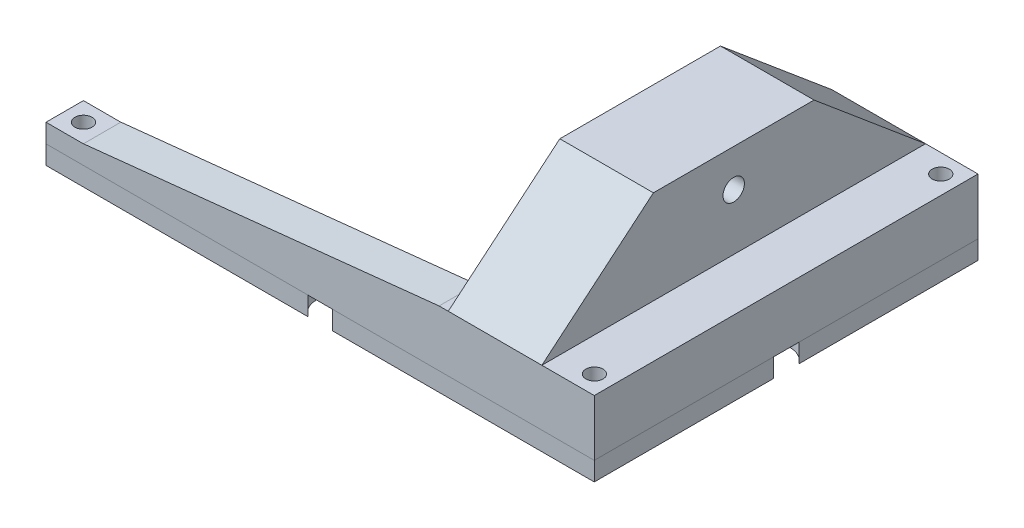
ISO-10303-21;
HEADER;
FILE_DESCRIPTION(('STEP AP214'),'2;1');
FILE_NAME('part.step','',(''),(''),'','','');
FILE_SCHEMA(('AUTOMOTIVE_DESIGN { 1 0 10303 214 1 1 1 1 }'));
ENDSEC;
DATA;
#1=APPLICATION_CONTEXT('core data for automotive mechanical design processes');
#2=APPLICATION_PROTOCOL_DEFINITION('international standard','automotive_design',2000,#1);
#3=PRODUCT_CONTEXT('',#1,'mechanical');
#4=PRODUCT('Part','Part','',(#3));
#5=PRODUCT_RELATED_PRODUCT_CATEGORY('part','',(#4));
#6=PRODUCT_DEFINITION_FORMATION('','',#4);
#7=PRODUCT_DEFINITION_CONTEXT('part definition',#1,'design');
#8=PRODUCT_DEFINITION('design','',#6,#7);
#9=PRODUCT_DEFINITION_SHAPE('','',#8);
#10=(LENGTH_UNIT() NAMED_UNIT(*) SI_UNIT(.MILLI.,.METRE.));
#11=(NAMED_UNIT(*) PLANE_ANGLE_UNIT() SI_UNIT($,.RADIAN.));
#12=(NAMED_UNIT(*) SI_UNIT($,.STERADIAN.) SOLID_ANGLE_UNIT());
#13=UNCERTAINTY_MEASURE_WITH_UNIT(LENGTH_MEASURE(1.E-05),#10,'distance_accuracy_value','');
#14=(GEOMETRIC_REPRESENTATION_CONTEXT(3) GLOBAL_UNCERTAINTY_ASSIGNED_CONTEXT((#13)) GLOBAL_UNIT_ASSIGNED_CONTEXT((#10,
#11,#12)) REPRESENTATION_CONTEXT('',''));
#15=CARTESIAN_POINT('',(0.,0.,0.));
#16=DIRECTION('',(0.,0.,1.));
#17=DIRECTION('',(1.,0.,0.));
#18=AXIS2_PLACEMENT_3D('',#15,#16,#17);
#19=CARTESIAN_POINT('',(-8.44101930610675,266.195974268059,0.));
#20=DIRECTION('',(-1.,0.,0.));
#21=DIRECTION('',(0.,-1.,0.));
#22=AXIS2_PLACEMENT_3D('',#19,#20,#21);
#23=PLANE('',#22);
#24=DIRECTION('',(0.,-1.,0.));
#25=VECTOR('',#24,1.);
#26=CARTESIAN_POINT('',(-8.44101930610706,266.195974268059,140.773129836377));
#27=LINE('',#26,#25);
#28=CARTESIAN_POINT('',(-8.44101930610693,256.195974268059,140.773129836377));
#29=VERTEX_POINT('',#28);
#30=CARTESIAN_POINT('',(-8.44101930610696,251.195974268059,140.773129836377));
#31=VERTEX_POINT('',#30);
#32=EDGE_CURVE('E151',#29,#31,#27,.T.);
#33=ORIENTED_EDGE('',*,*,#32,.F.);
#34=DIRECTION('',(0.,0.,1.));
#35=VECTOR('',#34,1.);
#36=CARTESIAN_POINT('',(-8.44101930610691,256.195974268059,130.773129836377));
#37=LINE('',#36,#35);
#38=CARTESIAN_POINT('',(-8.44101930610691,256.195974268059,130.773129836377));
#39=VERTEX_POINT('',#38);
#40=EDGE_CURVE('E140',#39,#29,#37,.T.);
#41=ORIENTED_EDGE('',*,*,#40,.F.);
#42=DIRECTION('',(0.,-1.,0.));
#43=VECTOR('',#42,1.);
#44=CARTESIAN_POINT('',(-8.44101930610704,266.195974268059,130.773129836377));
#45=LINE('',#44,#43);
#46=CARTESIAN_POINT('',(-8.44101930610693,251.195974268059,130.773129836377));
#47=VERTEX_POINT('',#46);
#48=EDGE_CURVE('E149',#39,#47,#45,.T.);
#49=ORIENTED_EDGE('',*,*,#48,.T.);
#50=DIRECTION('',(0.,0.,-1.));
#51=VECTOR('',#50,1.);
#52=CARTESIAN_POINT('',(-8.44101930610664,251.195974268059,0.));
#53=LINE('',#52,#51);
#54=EDGE_CURVE('E258',#31,#47,#53,.T.);
#55=ORIENTED_EDGE('',*,*,#54,.F.);
#56=EDGE_LOOP('',(#33,#41,#49,#55));
#57=FACE_BOUND('',#56,.T.);
#58=ADVANCED_FACE('F46',(#57),#23,.T.);
#59=CARTESIAN_POINT('',(-3.44101930610689,266.195974268059,135.773129836377));
#60=DIRECTION('',(0.,-1.,0.));
#61=DIRECTION('',(1.,0.,0.));
#62=AXIS2_PLACEMENT_3D('',#59,#60,#61);
#63=CYLINDRICAL_SURFACE('',#62,2.3);
#64=CARTESIAN_POINT('',(-3.44101930610678,251.195974268059,135.773129836377));
#65=DIRECTION('',(0.,1.,0.));
#66=DIRECTION('',(-1.,0.,0.));
#67=AXIS2_PLACEMENT_3D('',#64,#65,#66);
#68=CIRCLE('',#67,2.3);
#69=CARTESIAN_POINT('',(-5.74101930610678,251.195974268059,135.773129836377));
#70=VERTEX_POINT('',#69);
#71=EDGE_CURVE('E248',#70,#70,#68,.T.);
#72=ORIENTED_EDGE('',*,*,#71,.F.);
#73=EDGE_LOOP('',(#72));
#74=FACE_BOUND('',#73,.T.);
#75=CARTESIAN_POINT('',(-3.44101930610682,256.195974268059,135.773129836377));
#76=DIRECTION('',(0.,1.,0.));
#77=DIRECTION('',(-1.,0.,0.));
#78=AXIS2_PLACEMENT_3D('',#75,#76,#77);
#79=CIRCLE('',#78,2.3);
#80=CARTESIAN_POINT('',(-5.74101930610682,256.195974268059,135.773129836377));
#81=VERTEX_POINT('',#80);
#82=EDGE_CURVE('E172',#81,#81,#79,.T.);
#83=ORIENTED_EDGE('',*,*,#82,.T.);
#84=EDGE_LOOP('',(#83));
#85=FACE_BOUND('',#84,.T.);
#86=ADVANCED_FACE('F312',(#74,#85),#63,.F.);
#87=CARTESIAN_POINT('',(-1.86544632828996E-12,266.195974268059,0.));
#88=DIRECTION('',(0.,1.,0.));
#89=DIRECTION('',(-1.,0.,0.));
#90=AXIS2_PLACEMENT_3D('',#87,#88,#89);
#91=PLANE('',#90);
#92=DIRECTION('',(0.,0.,-1.));
#93=VECTOR('',#92,1.);
#94=CARTESIAN_POINT('',(124.010541363209,266.19597426806,140.773129836377));
#95=LINE('',#94,#93);
#96=CARTESIAN_POINT('',(124.010541363209,266.19597426806,140.773129836377));
#97=VERTEX_POINT('',#96);
#98=CARTESIAN_POINT('',(124.010541363209,266.19597426806,38.2731298363773));
#99=VERTEX_POINT('',#98);
#100=EDGE_CURVE('E212',#97,#99,#95,.T.);
#101=ORIENTED_EDGE('',*,*,#100,.F.);
#102=DIRECTION('',(-1.,0.,0.));
#103=VECTOR('',#102,1.);
#104=CARTESIAN_POINT('',(-1.86544632828996E-12,266.195974268059,140.773129836377));
#105=LINE('',#104,#103);
#106=CARTESIAN_POINT('',(138.010541363209,266.19597426806,140.773129836377));
#107=VERTEX_POINT('',#106);
#108=EDGE_CURVE('E236',#107,#97,#105,.T.);
#109=ORIENTED_EDGE('',*,*,#108,.F.);
#110=DIRECTION('',(0.,0.,1.));
#111=VECTOR('',#110,1.);
#112=CARTESIAN_POINT('',(138.010541363209,266.19597426806,0.));
#113=LINE('',#112,#111);
#114=CARTESIAN_POINT('',(138.010541363209,266.19597426806,38.2731298363773));
#115=VERTEX_POINT('',#114);
#116=EDGE_CURVE('E239',#115,#107,#113,.T.);
#117=ORIENTED_EDGE('',*,*,#116,.F.);
#118=DIRECTION('',(1.,0.,0.));
#119=VECTOR('',#118,1.);
#120=CARTESIAN_POINT('',(-1.86544632828996E-12,266.195974268059,38.2731298363773));
#121=LINE('',#120,#119);
#122=EDGE_CURVE('E231',#99,#115,#121,.T.);
#123=ORIENTED_EDGE('',*,*,#122,.F.);
#124=EDGE_LOOP('',(#101,#109,#117,#123));
#125=FACE_BOUND('',#124,.T.);
#126=CARTESIAN_POINT('',(133.058980693896,266.19597426806,135.773129836377));
#127=DIRECTION('',(0.,1.,0.));
#128=DIRECTION('',(-1.,0.,0.));
#129=AXIS2_PLACEMENT_3D('',#126,#127,#128);
#130=CIRCLE('',#129,2.30000000000001);
#131=CARTESIAN_POINT('',(130.758980693896,266.19597426806,135.773129836377));
#132=VERTEX_POINT('',#131);
#133=EDGE_CURVE('E227',#132,#132,#130,.T.);
#134=ORIENTED_EDGE('',*,*,#133,.F.);
#135=EDGE_LOOP('',(#134));
#136=FACE_BOUND('',#135,.T.);
#137=CARTESIAN_POINT('',(133.058980693896,266.19597426806,43.2731298363772));
#138=DIRECTION('',(0.,1.,0.));
#139=DIRECTION('',(-1.,0.,0.));
#140=AXIS2_PLACEMENT_3D('',#137,#138,#139);
#141=CIRCLE('',#140,2.30000000000001);
#142=CARTESIAN_POINT('',(130.758980693896,266.19597426806,43.2731298363772));
#143=VERTEX_POINT('',#142);
#144=EDGE_CURVE('E224',#143,#143,#141,.T.);
#145=ORIENTED_EDGE('',*,*,#144,.F.);
#146=EDGE_LOOP('',(#145));
#147=FACE_BOUND('',#146,.T.);
#148=ADVANCED_FACE('F285',(#125,#136,#147),#91,.T.);
#149=CARTESIAN_POINT('',(-1.86544632828996E-12,266.195974268059,38.2731298363773));
#150=DIRECTION('',(0.,0.,-1.));
#151=DIRECTION('',(-1.,0.,0.));
#152=AXIS2_PLACEMENT_3D('',#149,#150,#151);
#153=PLANE('',#152);
#154=DIRECTION('',(0.,-1.,0.));
#155=VECTOR('',#154,1.);
#156=CARTESIAN_POINT('',(99.0105413632086,266.19597426806,38.2731298363773));
#157=LINE('',#156,#155);
#158=CARTESIAN_POINT('',(99.0105413632086,266.19597426806,38.2731298363773));
#159=VERTEX_POINT('',#158);
#160=CARTESIAN_POINT('',(99.0105413632087,251.19597426806,38.2731298363773));
#161=VERTEX_POINT('',#160);
#162=EDGE_CURVE('E160',#159,#161,#157,.T.);
#163=ORIENTED_EDGE('',*,*,#162,.F.);
#164=DIRECTION('',(1.,0.,0.));
#165=VECTOR('',#164,1.);
#166=CARTESIAN_POINT('',(-1.86544632828996E-12,266.195974268059,38.2731298363773));
#167=LINE('',#166,#165);
#168=EDGE_CURVE('E189',#159,#99,#167,.T.);
#169=ORIENTED_EDGE('',*,*,#168,.T.);
#170=ORIENTED_EDGE('',*,*,#122,.T.);
#171=DIRECTION('',(0.,-1.,0.));
#172=VECTOR('',#171,1.);
#173=CARTESIAN_POINT('',(138.010541363209,266.19597426806,38.2731298363773));
#174=LINE('',#173,#172);
#175=CARTESIAN_POINT('',(138.010541363209,251.19597426806,38.2731298363773));
#176=VERTEX_POINT('',#175);
#177=EDGE_CURVE('E242',#115,#176,#174,.T.);
#178=ORIENTED_EDGE('',*,*,#177,.T.);
#179=DIRECTION('',(1.,0.,0.));
#180=VECTOR('',#179,1.);
#181=CARTESIAN_POINT('',(-1.75892287314486E-12,251.195974268059,38.2731298363773));
#182=LINE('',#181,#180);
#183=EDGE_CURVE('E251',#161,#176,#182,.T.);
#184=ORIENTED_EDGE('',*,*,#183,.F.);
#185=EDGE_LOOP('',(#163,#169,#170,#178,#184));
#186=FACE_BOUND('',#185,.T.);
#187=ADVANCED_FACE('F280',(#186),#153,.T.);
#188=CARTESIAN_POINT('',(99.0105413632086,266.19597426806,0.));
#189=DIRECTION('',(-1.,0.,0.));
#190=DIRECTION('',(0.,-1.,0.));
#191=AXIS2_PLACEMENT_3D('',#188,#189,#190);
#192=PLANE('',#191);
#193=CARTESIAN_POINT('',(99.0105413632085,281.19597426806,89.5231298363772));
#194=DIRECTION('',(-1.,0.,0.));
#195=DIRECTION('',(0.,-1.,0.));
#196=AXIS2_PLACEMENT_3D('',#193,#194,#195);
#197=CIRCLE('',#196,2.86);
#198=CARTESIAN_POINT('',(99.0105413632085,278.33597426806,89.5231298363772));
#199=VERTEX_POINT('',#198);
#200=EDGE_CURVE('E171',#199,#199,#197,.T.);
#201=ORIENTED_EDGE('',*,*,#200,.F.);
#202=EDGE_LOOP('',(#201));
#203=FACE_BOUND('',#202,.T.);
#204=DIRECTION('',(0.,0.,1.));
#205=VECTOR('',#204,1.);
#206=CARTESIAN_POINT('',(99.0105413632087,266.19597426806,38.2731298363773));
#207=LINE('',#206,#205);
#208=CARTESIAN_POINT('',(99.0105413632086,266.19597426806,130.773129836377));
#209=VERTEX_POINT('',#208);
#210=CARTESIAN_POINT('',(99.0105413632087,266.19597426806,140.773129836377));
#211=VERTEX_POINT('',#210);
#212=EDGE_CURVE('E167',#209,#211,#207,.T.);
#213=ORIENTED_EDGE('',*,*,#212,.T.);
#214=DIRECTION('',(0.,-0.64278760968654,0.766044443118977));
#215=VECTOR('',#214,1.);
#216=CARTESIAN_POINT('',(99.0105413632081,335.513209107389,58.1640661879102));
#217=LINE('',#216,#215);
#218=CARTESIAN_POINT('',(99.0105413632085,291.19597426806,110.979290021522));
#219=VERTEX_POINT('',#218);
#220=EDGE_CURVE('E187',#211,#219,#217,.F.);
#221=ORIENTED_EDGE('',*,*,#220,.T.);
#222=DIRECTION('',(0.,0.,1.));
#223=VECTOR('',#222,1.);
#224=CARTESIAN_POINT('',(99.0105413632085,291.19597426806,38.2731298363773));
#225=LINE('',#224,#223);
#226=CARTESIAN_POINT('',(99.0105413632085,291.19597426806,68.0669696512326));
#227=VERTEX_POINT('',#226);
#228=EDGE_CURVE('E213',#227,#219,#225,.T.);
#229=ORIENTED_EDGE('',*,*,#228,.F.);
#230=DIRECTION('',(0.,0.642787609686541,0.766044443118977));
#231=VECTOR('',#230,1.);
#232=CARTESIAN_POINT('',(99.0105413632087,247.350136770606,15.8135352933404));
#233=LINE('',#232,#231);
#234=EDGE_CURVE('E185',#227,#159,#233,.F.);
#235=ORIENTED_EDGE('',*,*,#234,.T.);
#236=ORIENTED_EDGE('',*,*,#162,.T.);
#237=DIRECTION('',(0.,0.,-1.));
#238=VECTOR('',#237,1.);
#239=CARTESIAN_POINT('',(99.0105413632087,251.19597426806,0.));
#240=LINE('',#239,#238);
#241=CARTESIAN_POINT('',(99.0105413632087,251.19597426806,130.773129836377));
#242=VERTEX_POINT('',#241);
#243=EDGE_CURVE('E254',#242,#161,#240,.T.);
#244=ORIENTED_EDGE('',*,*,#243,.F.);
#245=DIRECTION('',(0.,-1.,0.));
#246=VECTOR('',#245,1.);
#247=CARTESIAN_POINT('',(99.0105413632086,266.19597426806,130.773129836377));
#248=LINE('',#247,#246);
#249=EDGE_CURVE('E158',#209,#242,#248,.T.);
#250=ORIENTED_EDGE('',*,*,#249,.F.);
#251=EDGE_LOOP('',(#213,#221,#229,#235,#236,#244,#250));
#252=FACE_BOUND('',#251,.T.);
#253=ADVANCED_FACE('F294',(#203,#252),#192,.T.);
#254=CARTESIAN_POINT('',(-1.86544632828996E-12,266.195974268059,130.773129836377));
#255=DIRECTION('',(0.,0.,-1.));
#256=DIRECTION('',(-1.,0.,0.));
#257=AXIS2_PLACEMENT_3D('',#254,#255,#256);
#258=PLANE('',#257);
#259=DIRECTION('',(0.,1.,0.));
#260=VECTOR('',#259,1.);
#261=CARTESIAN_POINT('',(1.55898069389305,256.195974268059,130.773129836377));
#262=LINE('',#261,#260);
#263=CARTESIAN_POINT('',(1.55898069389305,256.195974268059,130.773129836377));
#264=VERTEX_POINT('',#263);
#265=CARTESIAN_POINT('',(1.55898069389305,256.21107191782,130.773129836377));
#266=VERTEX_POINT('',#265);
#267=EDGE_CURVE('E194',#264,#266,#262,.T.);
#268=ORIENTED_EDGE('',*,*,#267,.T.);
#269=DIRECTION('',(0.994521895368273,0.104528463267658,0.));
#270=VECTOR('',#269,1.);
#271=CARTESIAN_POINT('',(1.05502269942807,256.158103798205,130.773129836377));
#272=LINE('',#271,#270);
#273=CARTESIAN_POINT('',(96.5589806938965,266.19597426806,130.773129836377));
#274=VERTEX_POINT('',#273);
#275=EDGE_CURVE('E68',#266,#274,#272,.T.);
#276=ORIENTED_EDGE('',*,*,#275,.T.);
#277=DIRECTION('',(1.,0.,0.));
#278=VECTOR('',#277,1.);
#279=CARTESIAN_POINT('',(-1.86544632828996E-12,266.195974268059,130.773129836377));
#280=LINE('',#279,#278);
#281=EDGE_CURVE('E233',#274,#209,#280,.T.);
#282=ORIENTED_EDGE('',*,*,#281,.T.);
#283=ORIENTED_EDGE('',*,*,#249,.T.);
#284=DIRECTION('',(1.,0.,0.));
#285=VECTOR('',#284,1.);
#286=CARTESIAN_POINT('',(-1.75892287314486E-12,251.195974268059,130.773129836377));
#287=LINE('',#286,#285);
#288=EDGE_CURVE('E156',#47,#242,#287,.T.);
#289=ORIENTED_EDGE('',*,*,#288,.F.);
#290=ORIENTED_EDGE('',*,*,#48,.F.);
#291=DIRECTION('',(-1.,0.,0.));
#292=VECTOR('',#291,1.);
#293=CARTESIAN_POINT('',(1.55898069389305,256.195974268059,130.773129836377));
#294=LINE('',#293,#292);
#295=EDGE_CURVE('E137',#264,#39,#294,.T.);
#296=ORIENTED_EDGE('',*,*,#295,.F.);
#297=EDGE_LOOP('',(#268,#276,#282,#283,#289,#290,#296));
#298=FACE_BOUND('',#297,.T.);
#299=ADVANCED_FACE('F154',(#298),#258,.T.);
#300=CARTESIAN_POINT('',(-1.86544632828996E-12,266.195974268059,140.773129836377));
#301=DIRECTION('',(0.,0.,1.));
#302=DIRECTION('',(1.,0.,0.));
#303=AXIS2_PLACEMENT_3D('',#300,#301,#302);
#304=PLANE('',#303);
#305=CARTESIAN_POINT('',(96.5589806938965,266.19597426806,140.773129836377));
#306=VERTEX_POINT('',#305);
#307=EDGE_CURVE('E235',#211,#306,#105,.T.);
#308=ORIENTED_EDGE('',*,*,#307,.T.);
#309=DIRECTION('',(-0.994521895368273,-0.104528463267658,0.));
#310=VECTOR('',#309,1.);
#311=CARTESIAN_POINT('',(1.05502269942807,256.158103798205,140.773129836377));
#312=LINE('',#311,#310);
#313=CARTESIAN_POINT('',(1.55898069389305,256.21107191782,140.773129836377));
#314=VERTEX_POINT('',#313);
#315=EDGE_CURVE('E12',#306,#314,#312,.T.);
#316=ORIENTED_EDGE('',*,*,#315,.T.);
#317=DIRECTION('',(0.,1.,0.));
#318=VECTOR('',#317,1.);
#319=CARTESIAN_POINT('',(1.55898069389305,256.195974268059,140.773129836377));
#320=LINE('',#319,#318);
#321=CARTESIAN_POINT('',(1.55898069389305,256.195974268059,140.773129836377));
#322=VERTEX_POINT('',#321);
#323=EDGE_CURVE('E202',#322,#314,#320,.T.);
#324=ORIENTED_EDGE('',*,*,#323,.F.);
#325=DIRECTION('',(1.,0.,0.));
#326=VECTOR('',#325,1.);
#327=CARTESIAN_POINT('',(-8.44101930610693,256.195974268059,140.773129836377));
#328=LINE('',#327,#326);
#329=EDGE_CURVE('E152',#29,#322,#328,.T.);
#330=ORIENTED_EDGE('',*,*,#329,.F.);
#331=ORIENTED_EDGE('',*,*,#32,.T.);
#332=DIRECTION('',(-1.,0.,0.));
#333=VECTOR('',#332,1.);
#334=CARTESIAN_POINT('',(-1.75892287314486E-12,251.195974268059,140.773129836377));
#335=LINE('',#334,#333);
#336=CARTESIAN_POINT('',(138.010541363209,251.19597426806,140.773129836377));
#337=VERTEX_POINT('',#336);
#338=EDGE_CURVE('E260',#337,#31,#335,.T.);
#339=ORIENTED_EDGE('',*,*,#338,.F.);
#340=DIRECTION('',(0.,-1.,0.));
#341=VECTOR('',#340,1.);
#342=CARTESIAN_POINT('',(138.010541363209,266.19597426806,140.773129836377));
#343=LINE('',#342,#341);
#344=EDGE_CURVE('E162',#107,#337,#343,.T.);
#345=ORIENTED_EDGE('',*,*,#344,.F.);
#346=ORIENTED_EDGE('',*,*,#108,.T.);
#347=DIRECTION('',(-1.,0.,0.));
#348=VECTOR('',#347,1.);
#349=CARTESIAN_POINT('',(-1.86544632828996E-12,266.195974268059,140.773129836377));
#350=LINE('',#349,#348);
#351=EDGE_CURVE('E183',#97,#211,#350,.T.);
#352=ORIENTED_EDGE('',*,*,#351,.T.);
#353=EDGE_LOOP('',(#308,#316,#324,#330,#331,#339,#345,#346,#352));
#354=FACE_BOUND('',#353,.T.);
#355=ADVANCED_FACE('F273',(#354),#304,.T.);
#356=CARTESIAN_POINT('',(133.058980693896,266.19597426806,135.773129836377));
#357=DIRECTION('',(0.,-1.,0.));
#358=DIRECTION('',(1.,0.,0.));
#359=AXIS2_PLACEMENT_3D('',#356,#357,#358);
#360=CYLINDRICAL_SURFACE('',#359,2.30000000000001);
#361=ORIENTED_EDGE('',*,*,#133,.T.);
#362=EDGE_LOOP('',(#361));
#363=FACE_BOUND('',#362,.T.);
#364=CARTESIAN_POINT('',(133.058980693896,251.19597426806,135.773129836377));
#365=DIRECTION('',(0.,1.,0.));
#366=DIRECTION('',(-1.,0.,0.));
#367=AXIS2_PLACEMENT_3D('',#364,#365,#366);
#368=CIRCLE('',#367,2.30000000000001);
#369=CARTESIAN_POINT('',(130.758980693896,251.19597426806,135.773129836377));
#370=VERTEX_POINT('',#369);
#371=EDGE_CURVE('E245',#370,#370,#368,.T.);
#372=ORIENTED_EDGE('',*,*,#371,.F.);
#373=EDGE_LOOP('',(#372));
#374=FACE_BOUND('',#373,.T.);
#375=ADVANCED_FACE('F329',(#363,#374),#360,.F.);
#376=CARTESIAN_POINT('',(133.058980693896,266.19597426806,43.2731298363772));
#377=DIRECTION('',(0.,-1.,0.));
#378=DIRECTION('',(1.,0.,0.));
#379=AXIS2_PLACEMENT_3D('',#376,#377,#378);
#380=CYLINDRICAL_SURFACE('',#379,2.30000000000001);
#381=ORIENTED_EDGE('',*,*,#144,.T.);
#382=EDGE_LOOP('',(#381));
#383=FACE_BOUND('',#382,.T.);
#384=CARTESIAN_POINT('',(133.058980693896,251.19597426806,43.2731298363772));
#385=DIRECTION('',(0.,1.,0.));
#386=DIRECTION('',(-1.,0.,0.));
#387=AXIS2_PLACEMENT_3D('',#384,#385,#386);
#388=CIRCLE('',#387,2.30000000000001);
#389=CARTESIAN_POINT('',(130.758980693896,251.19597426806,43.2731298363772));
#390=VERTEX_POINT('',#389);
#391=EDGE_CURVE('E219',#390,#390,#388,.T.);
#392=ORIENTED_EDGE('',*,*,#391,.F.);
#393=EDGE_LOOP('',(#392));
#394=FACE_BOUND('',#393,.T.);
#395=ADVANCED_FACE('F332',(#383,#394),#380,.F.);
#396=CARTESIAN_POINT('',(138.010541363209,266.19597426806,0.));
#397=DIRECTION('',(1.,0.,0.));
#398=DIRECTION('',(0.,1.,0.));
#399=AXIS2_PLACEMENT_3D('',#396,#397,#398);
#400=PLANE('',#399);
#401=DIRECTION('',(0.,0.,1.));
#402=VECTOR('',#401,1.);
#403=CARTESIAN_POINT('',(138.010541363209,251.19597426806,0.));
#404=LINE('',#403,#402);
#405=EDGE_CURVE('E228',#176,#337,#404,.T.);
#406=ORIENTED_EDGE('',*,*,#405,.F.);
#407=ORIENTED_EDGE('',*,*,#177,.F.);
#408=ORIENTED_EDGE('',*,*,#116,.T.);
#409=ORIENTED_EDGE('',*,*,#344,.T.);
#410=EDGE_LOOP('',(#406,#407,#408,#409));
#411=FACE_BOUND('',#410,.T.);
#412=ADVANCED_FACE('F268',(#411),#400,.T.);
#413=ORIENTED_EDGE('',*,*,#281,.F.);
#414=DIRECTION('',(0.,0.,1.));
#415=VECTOR('',#414,1.);
#416=CARTESIAN_POINT('',(96.5589806938965,266.19597426806,140.773129836377));
#417=LINE('',#416,#415);
#418=EDGE_CURVE('E54',#274,#306,#417,.T.);
#419=ORIENTED_EDGE('',*,*,#418,.T.);
#420=ORIENTED_EDGE('',*,*,#307,.F.);
#421=ORIENTED_EDGE('',*,*,#212,.F.);
#422=EDGE_LOOP('',(#413,#419,#420,#421));
#423=FACE_BOUND('',#422,.T.);
#424=ADVANCED_FACE('F304',(#423),#91,.T.);
#425=CARTESIAN_POINT('',(-1.75892287314486E-12,251.195974268059,0.));
#426=DIRECTION('',(0.,1.,0.));
#427=DIRECTION('',(-1.,0.,0.));
#428=AXIS2_PLACEMENT_3D('',#425,#426,#427);
#429=PLANE('',#428);
#430=ORIENTED_EDGE('',*,*,#391,.T.);
#431=EDGE_LOOP('',(#430));
#432=FACE_BOUND('',#431,.T.);
#433=ORIENTED_EDGE('',*,*,#371,.T.);
#434=EDGE_LOOP('',(#433));
#435=FACE_BOUND('',#434,.T.);
#436=ORIENTED_EDGE('',*,*,#71,.T.);
#437=EDGE_LOOP('',(#436));
#438=FACE_BOUND('',#437,.T.);
#439=ORIENTED_EDGE('',*,*,#183,.T.);
#440=ORIENTED_EDGE('',*,*,#405,.T.);
#441=ORIENTED_EDGE('',*,*,#338,.T.);
#442=ORIENTED_EDGE('',*,*,#54,.T.);
#443=ORIENTED_EDGE('',*,*,#288,.T.);
#444=ORIENTED_EDGE('',*,*,#243,.T.);
#445=EDGE_LOOP('',(#439,#440,#441,#442,#443,#444));
#446=FACE_BOUND('',#445,.T.);
#447=ADVANCED_FACE('F275',(#432,#435,#438,#446),#429,.F.);
#448=CARTESIAN_POINT('',(124.010541363209,291.19597426806,140.773129836377));
#449=DIRECTION('',(-1.,0.,0.));
#450=DIRECTION('',(0.,-1.,0.));
#451=AXIS2_PLACEMENT_3D('',#448,#449,#450);
#452=PLANE('',#451);
#453=CARTESIAN_POINT('',(124.010541363209,281.19597426806,89.5231298363772));
#454=DIRECTION('',(-1.,0.,0.));
#455=DIRECTION('',(0.,-1.,0.));
#456=AXIS2_PLACEMENT_3D('',#453,#454,#455);
#457=CIRCLE('',#456,2.86);
#458=CARTESIAN_POINT('',(124.010541363209,278.33597426806,89.5231298363772));
#459=VERTEX_POINT('',#458);
#460=EDGE_CURVE('E168',#459,#459,#457,.T.);
#461=ORIENTED_EDGE('',*,*,#460,.T.);
#462=EDGE_LOOP('',(#461));
#463=FACE_BOUND('',#462,.T.);
#464=DIRECTION('',(0.,0.,-1.));
#465=VECTOR('',#464,1.);
#466=CARTESIAN_POINT('',(124.010541363209,291.19597426806,140.773129836377));
#467=LINE('',#466,#465);
#468=CARTESIAN_POINT('',(124.010541363209,291.19597426806,110.979290021522));
#469=VERTEX_POINT('',#468);
#470=CARTESIAN_POINT('',(124.010541363209,291.19597426806,68.0669696512326));
#471=VERTEX_POINT('',#470);
#472=EDGE_CURVE('E216',#469,#471,#467,.T.);
#473=ORIENTED_EDGE('',*,*,#472,.F.);
#474=DIRECTION('',(0.,0.64278760968654,-0.766044443118977));
#475=VECTOR('',#474,1.);
#476=CARTESIAN_POINT('',(124.010541363209,291.19597426806,110.979290021522));
#477=LINE('',#476,#475);
#478=EDGE_CURVE('E181',#469,#97,#477,.F.);
#479=ORIENTED_EDGE('',*,*,#478,.T.);
#480=ORIENTED_EDGE('',*,*,#100,.T.);
#481=DIRECTION('',(0.,-0.642787609686541,-0.766044443118977));
#482=VECTOR('',#481,1.);
#483=CARTESIAN_POINT('',(124.010541363209,291.19597426806,68.0669696512326));
#484=LINE('',#483,#482);
#485=EDGE_CURVE('E179',#99,#471,#484,.F.);
#486=ORIENTED_EDGE('',*,*,#485,.T.);
#487=EDGE_LOOP('',(#473,#479,#480,#486));
#488=FACE_BOUND('',#487,.T.);
#489=ADVANCED_FACE('F352',(#463,#488),#452,.F.);
#490=CARTESIAN_POINT('',(-1.95269841221964E-12,291.195974268059,0.));
#491=DIRECTION('',(0.,1.,0.));
#492=DIRECTION('',(-1.,0.,0.));
#493=AXIS2_PLACEMENT_3D('',#490,#491,#492);
#494=PLANE('',#493);
#495=ORIENTED_EDGE('',*,*,#228,.T.);
#496=DIRECTION('',(1.,0.,0.));
#497=VECTOR('',#496,1.);
#498=CARTESIAN_POINT('',(-1.95269841221964E-12,291.195974268059,110.979290021522));
#499=LINE('',#498,#497);
#500=EDGE_CURVE('E176',#219,#469,#499,.T.);
#501=ORIENTED_EDGE('',*,*,#500,.T.);
#502=ORIENTED_EDGE('',*,*,#472,.T.);
#503=DIRECTION('',(-1.,0.,0.));
#504=VECTOR('',#503,1.);
#505=CARTESIAN_POINT('',(-1.95269841221964E-12,291.195974268059,68.0669696512326));
#506=LINE('',#505,#504);
#507=EDGE_CURVE('E173',#471,#227,#506,.T.);
#508=ORIENTED_EDGE('',*,*,#507,.T.);
#509=EDGE_LOOP('',(#495,#501,#502,#508));
#510=FACE_BOUND('',#509,.T.);
#511=ADVANCED_FACE('F298',(#510),#494,.T.);
#512=CARTESIAN_POINT('',(-8.44101930610731,281.195974268059,89.5231298363772));
#513=DIRECTION('',(1.,0.,0.));
#514=DIRECTION('',(0.,1.,0.));
#515=AXIS2_PLACEMENT_3D('',#512,#513,#514);
#516=CYLINDRICAL_SURFACE('',#515,2.86);
#517=ORIENTED_EDGE('',*,*,#200,.T.);
#518=EDGE_LOOP('',(#517));
#519=FACE_BOUND('',#518,.T.);
#520=ORIENTED_EDGE('',*,*,#460,.F.);
#521=EDGE_LOOP('',(#520));
#522=FACE_BOUND('',#521,.T.);
#523=ADVANCED_FACE('F338',(#519,#522),#516,.F.);
#524=CARTESIAN_POINT('',(-1.95269841221964E-12,291.195974268059,110.979290021522));
#525=DIRECTION('',(0.,-0.766044443118977,-0.64278760968654));
#526=DIRECTION('',(1.,0.,0.));
#527=AXIS2_PLACEMENT_3D('',#524,#525,#526);
#528=PLANE('',#527);
#529=ORIENTED_EDGE('',*,*,#220,.F.);
#530=ORIENTED_EDGE('',*,*,#351,.F.);
#531=ORIENTED_EDGE('',*,*,#478,.F.);
#532=ORIENTED_EDGE('',*,*,#500,.F.);
#533=EDGE_LOOP('',(#529,#530,#531,#532));
#534=FACE_BOUND('',#533,.T.);
#535=ADVANCED_FACE('F290',(#534),#528,.F.);
#536=CARTESIAN_POINT('',(-1.95269841221964E-12,291.195974268059,68.0669696512326));
#537=DIRECTION('',(0.,-0.766044443118977,0.64278760968654));
#538=DIRECTION('',(-1.,0.,0.));
#539=AXIS2_PLACEMENT_3D('',#536,#537,#538);
#540=PLANE('',#539);
#541=ORIENTED_EDGE('',*,*,#485,.F.);
#542=ORIENTED_EDGE('',*,*,#168,.F.);
#543=ORIENTED_EDGE('',*,*,#234,.F.);
#544=ORIENTED_EDGE('',*,*,#507,.F.);
#545=EDGE_LOOP('',(#541,#542,#543,#544));
#546=FACE_BOUND('',#545,.T.);
#547=ADVANCED_FACE('F303',(#546),#540,.F.);
#548=CARTESIAN_POINT('',(1.55898069389305,256.195974268059,140.773129836377));
#549=DIRECTION('',(1.,0.,0.));
#550=DIRECTION('',(0.,1.,0.));
#551=AXIS2_PLACEMENT_3D('',#548,#549,#550);
#552=PLANE('',#551);
#553=ORIENTED_EDGE('',*,*,#323,.T.);
#554=DIRECTION('',(0.,0.,-1.));
#555=VECTOR('',#554,1.);
#556=CARTESIAN_POINT('',(1.55898069389305,256.21107191782,130.773129836377));
#557=LINE('',#556,#555);
#558=EDGE_CURVE('E191',#314,#266,#557,.T.);
#559=ORIENTED_EDGE('',*,*,#558,.T.);
#560=ORIENTED_EDGE('',*,*,#267,.F.);
#561=DIRECTION('',(0.,0.,-1.));
#562=VECTOR('',#561,1.);
#563=CARTESIAN_POINT('',(1.55898069389305,256.195974268059,140.773129836377));
#564=LINE('',#563,#562);
#565=EDGE_CURVE('E143',#322,#264,#564,.T.);
#566=ORIENTED_EDGE('',*,*,#565,.F.);
#567=EDGE_LOOP('',(#553,#559,#560,#566));
#568=FACE_BOUND('',#567,.T.);
#569=ADVANCED_FACE('F200',(#568),#552,.F.);
#570=CARTESIAN_POINT('',(-1.4058936928546E-12,256.195974268059,0.));
#571=DIRECTION('',(0.,1.,0.));
#572=DIRECTION('',(-1.,0.,0.));
#573=AXIS2_PLACEMENT_3D('',#570,#571,#572);
#574=PLANE('',#573);
#575=ORIENTED_EDGE('',*,*,#82,.F.);
#576=EDGE_LOOP('',(#575));
#577=FACE_BOUND('',#576,.T.);
#578=ORIENTED_EDGE('',*,*,#295,.T.);
#579=ORIENTED_EDGE('',*,*,#40,.T.);
#580=ORIENTED_EDGE('',*,*,#329,.T.);
#581=ORIENTED_EDGE('',*,*,#565,.T.);
#582=EDGE_LOOP('',(#578,#579,#580,#581));
#583=FACE_BOUND('',#582,.T.);
#584=ADVANCED_FACE('F139',(#577,#583),#574,.T.);
#585=CARTESIAN_POINT('',(1.55898069389305,256.21107191782,140.773129836377));
#586=DIRECTION('',(-0.104528463267658,0.994521895368273,0.));
#587=DIRECTION('',(0.,0.,1.));
#588=AXIS2_PLACEMENT_3D('',#585,#586,#587);
#589=PLANE('',#588);
#590=ORIENTED_EDGE('',*,*,#315,.F.);
#591=ORIENTED_EDGE('',*,*,#418,.F.);
#592=ORIENTED_EDGE('',*,*,#275,.F.);
#593=ORIENTED_EDGE('',*,*,#558,.F.);
#594=EDGE_LOOP('',(#590,#591,#592,#593));
#595=FACE_BOUND('',#594,.T.);
#596=ADVANCED_FACE('F48',(#595),#589,.T.);
#597=CLOSED_SHELL('',(#58,#86,#148,#187,#253,#299,#355,#375,#395,#412,#424,#447,#489,#511,#523,
#535,#547,#569,#584,#596));
#598=MANIFOLD_SOLID_BREP('B2',#597);
#599=CARTESIAN_POINT('',(64.8089806938963,251.195974268059,135.773129836377));
#600=DIRECTION('',(0.,-1.,0.));
#601=DIRECTION('',(1.,0.,0.));
#602=AXIS2_PLACEMENT_3D('',#599,#600,#601);
#603=CYLINDRICAL_SURFACE('',#602,6.);
#604=CARTESIAN_POINT('',(64.8089806938964,246.195974268059,135.773129836377));
#605=DIRECTION('',(0.,1.,0.));
#606=DIRECTION('',(-1.,0.,0.));
#607=AXIS2_PLACEMENT_3D('',#604,#605,#606);
#608=CIRCLE('',#607,6.);
#609=CARTESIAN_POINT('',(61.492355903541,246.195974268059,130.773129836377));
#610=VERTEX_POINT('',#609);
#611=CARTESIAN_POINT('',(61.4923559035408,246.195974268059,140.773129836377));
#612=VERTEX_POINT('',#611);
#613=EDGE_CURVE('E583',#610,#612,#608,.T.);
#614=ORIENTED_EDGE('',*,*,#613,.F.);
#615=DIRECTION('',(0.,-1.,0.));
#616=VECTOR('',#615,1.);
#617=CARTESIAN_POINT('',(61.4923559035409,251.195974268059,130.773129836377));
#618=LINE('',#617,#616);
#619=CARTESIAN_POINT('',(61.4923559035409,251.195974268059,130.773129836377));
#620=VERTEX_POINT('',#619);
#621=EDGE_CURVE('E44',#620,#610,#618,.T.);
#622=ORIENTED_EDGE('',*,*,#621,.F.);
#623=CARTESIAN_POINT('',(64.8089806938963,251.195974268059,135.773129836377));
#624=DIRECTION('',(0.,1.,0.));
#625=DIRECTION('',(-1.,0.,0.));
#626=AXIS2_PLACEMENT_3D('',#623,#624,#625);
#627=CIRCLE('',#626,6.);
#628=CARTESIAN_POINT('',(61.4923559035408,251.195974268059,140.773129836377));
#629=VERTEX_POINT('',#628);
#630=EDGE_CURVE('E569',#620,#629,#627,.T.);
#631=ORIENTED_EDGE('',*,*,#630,.T.);
#632=DIRECTION('',(0.,-1.,0.));
#633=VECTOR('',#632,1.);
#634=CARTESIAN_POINT('',(61.4923559035408,251.195974268059,140.773129836377));
#635=LINE('',#634,#633);
#636=EDGE_CURVE('E551',#629,#612,#635,.T.);
#637=ORIENTED_EDGE('',*,*,#636,.T.);
#638=EDGE_LOOP('',(#614,#622,#631,#637));
#639=FACE_BOUND('',#638,.T.);
#640=ADVANCED_FACE('F512',(#639),#603,.F.);
#641=CARTESIAN_POINT('',(-1.75342589762973E-12,251.195974268059,130.773129836377));
#642=DIRECTION('',(0.,0.,1.));
#643=DIRECTION('',(0.,-1.,0.));
#644=AXIS2_PLACEMENT_3D('',#641,#642,#643);
#645=PLANE('',#644);
#646=DIRECTION('',(-1.,0.,0.));
#647=VECTOR('',#646,1.);
#648=CARTESIAN_POINT('',(-1.71836460183047E-12,246.195974268059,130.773129836377));
#649=LINE('',#648,#647);
#650=CARTESIAN_POINT('',(-8.44101930610689,246.195974268059,130.773129836377));
#651=VERTEX_POINT('',#650);
#652=EDGE_CURVE('E574',#610,#651,#649,.T.);
#653=ORIENTED_EDGE('',*,*,#652,.T.);
#654=DIRECTION('',(0.,-1.,0.));
#655=VECTOR('',#654,1.);
#656=CARTESIAN_POINT('',(-8.44101930610692,251.195974268059,130.773129836377));
#657=LINE('',#656,#655);
#658=CARTESIAN_POINT('',(-8.44101930610692,251.195974268059,130.773129836377));
#659=VERTEX_POINT('',#658);
#660=EDGE_CURVE('E521',#659,#651,#657,.T.);
#661=ORIENTED_EDGE('',*,*,#660,.F.);
#662=DIRECTION('',(-1.,0.,0.));
#663=VECTOR('',#662,1.);
#664=CARTESIAN_POINT('',(-1.75342589762973E-12,251.195974268059,130.773129836377));
#665=LINE('',#664,#663);
#666=EDGE_CURVE('E566',#620,#659,#665,.T.);
#667=ORIENTED_EDGE('',*,*,#666,.F.);
#668=ORIENTED_EDGE('',*,*,#621,.T.);
#669=EDGE_LOOP('',(#653,#661,#667,#668));
#670=FACE_BOUND('',#669,.T.);
#671=ADVANCED_FACE('F572',(#670),#645,.F.);
#672=CARTESIAN_POINT('',(-8.44101930610692,251.195974268059,0.));
#673=DIRECTION('',(1.,0.,0.));
#674=DIRECTION('',(0.,1.,0.));
#675=AXIS2_PLACEMENT_3D('',#672,#673,#674);
#676=PLANE('',#675);
#677=DIRECTION('',(0.,0.,1.));
#678=VECTOR('',#677,1.);
#679=CARTESIAN_POINT('',(-8.44101930610689,246.195974268059,0.));
#680=LINE('',#679,#678);
#681=CARTESIAN_POINT('',(-8.44101930610689,246.195974268059,140.773129836377));
#682=VERTEX_POINT('',#681);
#683=EDGE_CURVE('E580',#651,#682,#680,.T.);
#684=ORIENTED_EDGE('',*,*,#683,.T.);
#685=DIRECTION('',(0.,-1.,0.));
#686=VECTOR('',#685,1.);
#687=CARTESIAN_POINT('',(-8.44101930610692,251.195974268059,140.773129836377));
#688=LINE('',#687,#686);
#689=CARTESIAN_POINT('',(-8.44101930610692,251.195974268059,140.773129836377));
#690=VERTEX_POINT('',#689);
#691=EDGE_CURVE('E565',#690,#682,#688,.T.);
#692=ORIENTED_EDGE('',*,*,#691,.F.);
#693=DIRECTION('',(0.,0.,1.));
#694=VECTOR('',#693,1.);
#695=CARTESIAN_POINT('',(-8.44101930610692,251.195974268059,0.));
#696=LINE('',#695,#694);
#697=EDGE_CURVE('E559',#659,#690,#696,.T.);
#698=ORIENTED_EDGE('',*,*,#697,.F.);
#699=ORIENTED_EDGE('',*,*,#660,.T.);
#700=EDGE_LOOP('',(#684,#692,#698,#699));
#701=FACE_BOUND('',#700,.T.);
#702=ADVANCED_FACE('F562',(#701),#676,.F.);
#703=CARTESIAN_POINT('',(-3.44101930610677,251.195974268059,135.773129836377));
#704=DIRECTION('',(0.,-1.,0.));
#705=DIRECTION('',(1.,0.,0.));
#706=AXIS2_PLACEMENT_3D('',#703,#704,#705);
#707=CYLINDRICAL_SURFACE('',#706,2.3);
#708=CARTESIAN_POINT('',(-3.44101930610677,251.195974268059,135.773129836377));
#709=DIRECTION('',(0.,1.,0.));
#710=DIRECTION('',(-1.,0.,0.));
#711=AXIS2_PLACEMENT_3D('',#708,#709,#710);
#712=CIRCLE('',#711,2.3);
#713=CARTESIAN_POINT('',(-5.74101930610677,251.195974268059,135.773129836377));
#714=VERTEX_POINT('',#713);
#715=EDGE_CURVE('E579',#714,#714,#712,.T.);
#716=ORIENTED_EDGE('',*,*,#715,.T.);
#717=EDGE_LOOP('',(#716));
#718=FACE_BOUND('',#717,.T.);
#719=CARTESIAN_POINT('',(-3.44101930610673,246.195974268059,135.773129836377));
#720=DIRECTION('',(0.,1.,0.));
#721=DIRECTION('',(-1.,0.,0.));
#722=AXIS2_PLACEMENT_3D('',#719,#720,#721);
#723=CIRCLE('',#722,2.3);
#724=CARTESIAN_POINT('',(-5.74101930610674,246.195974268059,135.773129836377));
#725=VERTEX_POINT('',#724);
#726=EDGE_CURVE('E585',#725,#725,#723,.T.);
#727=ORIENTED_EDGE('',*,*,#726,.F.);
#728=EDGE_LOOP('',(#727));
#729=FACE_BOUND('',#728,.T.);
#730=ADVANCED_FACE('F514',(#718,#729),#707,.F.);
#731=CARTESIAN_POINT('',(-1.75342589762973E-12,251.195974268059,140.773129836377));
#732=DIRECTION('',(0.,0.,-1.));
#733=DIRECTION('',(0.,1.,0.));
#734=AXIS2_PLACEMENT_3D('',#731,#732,#733);
#735=PLANE('',#734);
#736=DIRECTION('',(1.,0.,0.));
#737=VECTOR('',#736,1.);
#738=CARTESIAN_POINT('',(-1.71836460183047E-12,246.195974268059,140.773129836377));
#739=LINE('',#738,#737);
#740=EDGE_CURVE('E544',#682,#612,#739,.T.);
#741=ORIENTED_EDGE('',*,*,#740,.T.);
#742=ORIENTED_EDGE('',*,*,#636,.F.);
#743=DIRECTION('',(1.,0.,0.));
#744=VECTOR('',#743,1.);
#745=CARTESIAN_POINT('',(-1.75342589762973E-12,251.195974268059,140.773129836377));
#746=LINE('',#745,#744);
#747=EDGE_CURVE('E529',#690,#629,#746,.T.);
#748=ORIENTED_EDGE('',*,*,#747,.F.);
#749=ORIENTED_EDGE('',*,*,#691,.T.);
#750=EDGE_LOOP('',(#741,#742,#748,#749));
#751=FACE_BOUND('',#750,.T.);
#752=ADVANCED_FACE('F597',(#751),#735,.F.);
#753=CARTESIAN_POINT('',(-1.75342589762973E-12,251.195974268059,0.));
#754=DIRECTION('',(0.,1.,0.));
#755=DIRECTION('',(-1.,0.,0.));
#756=AXIS2_PLACEMENT_3D('',#753,#754,#755);
#757=PLANE('',#756);
#758=ORIENTED_EDGE('',*,*,#715,.F.);
#759=EDGE_LOOP('',(#758));
#760=FACE_BOUND('',#759,.T.);
#761=ORIENTED_EDGE('',*,*,#630,.F.);
#762=ORIENTED_EDGE('',*,*,#666,.T.);
#763=ORIENTED_EDGE('',*,*,#697,.T.);
#764=ORIENTED_EDGE('',*,*,#747,.T.);
#765=EDGE_LOOP('',(#761,#762,#763,#764));
#766=FACE_BOUND('',#765,.T.);
#767=ADVANCED_FACE('F568',(#760,#766),#757,.T.);
#768=CARTESIAN_POINT('',(-1.71836460183047E-12,246.195974268059,0.));
#769=DIRECTION('',(0.,1.,0.));
#770=DIRECTION('',(-1.,0.,0.));
#771=AXIS2_PLACEMENT_3D('',#768,#769,#770);
#772=PLANE('',#771);
#773=ORIENTED_EDGE('',*,*,#726,.T.);
#774=EDGE_LOOP('',(#773));
#775=FACE_BOUND('',#774,.T.);
#776=ORIENTED_EDGE('',*,*,#613,.T.);
#777=ORIENTED_EDGE('',*,*,#740,.F.);
#778=ORIENTED_EDGE('',*,*,#683,.F.);
#779=ORIENTED_EDGE('',*,*,#652,.F.);
#780=EDGE_LOOP('',(#776,#777,#778,#779));
#781=FACE_BOUND('',#780,.T.);
#782=ADVANCED_FACE('F596',(#775,#781),#772,.F.);
#783=CLOSED_SHELL('',(#640,#671,#702,#730,#752,#767,#782));
#784=MANIFOLD_SOLID_BREP('B6',#783);
#785=CARTESIAN_POINT('',(64.8089806938963,251.195974268059,135.773129836377));
#786=DIRECTION('',(0.,-1.,0.));
#787=DIRECTION('',(1.,0.,0.));
#788=AXIS2_PLACEMENT_3D('',#785,#786,#787);
#789=CYLINDRICAL_SURFACE('',#788,6.);
#790=CARTESIAN_POINT('',(64.8089806938964,246.195974268059,135.773129836377));
#791=DIRECTION('',(0.,1.,0.));
#792=DIRECTION('',(-1.,0.,0.));
#793=AXIS2_PLACEMENT_3D('',#790,#791,#792);
#794=CIRCLE('',#793,6.);
#795=CARTESIAN_POINT('',(68.1256054842519,246.195974268059,140.773129836377));
#796=VERTEX_POINT('',#795);
#797=CARTESIAN_POINT('',(68.1256054842517,246.195974268059,130.773129836377));
#798=VERTEX_POINT('',#797);
#799=EDGE_CURVE('E758',#796,#798,#794,.T.);
#800=ORIENTED_EDGE('',*,*,#799,.F.);
#801=DIRECTION('',(0.,-1.,0.));
#802=VECTOR('',#801,1.);
#803=CARTESIAN_POINT('',(68.1256054842519,251.195974268059,140.773129836377));
#804=LINE('',#803,#802);
#805=CARTESIAN_POINT('',(68.1256054842519,251.195974268059,140.773129836377));
#806=VERTEX_POINT('',#805);
#807=EDGE_CURVE('E510',#806,#796,#804,.T.);
#808=ORIENTED_EDGE('',*,*,#807,.F.);
#809=CARTESIAN_POINT('',(64.8089806938963,251.195974268059,135.773129836377));
#810=DIRECTION('',(0.,1.,0.));
#811=DIRECTION('',(-1.,0.,0.));
#812=AXIS2_PLACEMENT_3D('',#809,#810,#811);
#813=CIRCLE('',#812,6.);
#814=CARTESIAN_POINT('',(68.1256054842517,251.195974268059,130.773129836377));
#815=VERTEX_POINT('',#814);
#816=EDGE_CURVE('E780',#806,#815,#813,.T.);
#817=ORIENTED_EDGE('',*,*,#816,.T.);
#818=DIRECTION('',(0.,-1.,0.));
#819=VECTOR('',#818,1.);
#820=CARTESIAN_POINT('',(68.1256054842517,251.195974268059,130.773129836377));
#821=LINE('',#820,#819);
#822=EDGE_CURVE('E708',#815,#798,#821,.T.);
#823=ORIENTED_EDGE('',*,*,#822,.T.);
#824=EDGE_LOOP('',(#800,#808,#817,#823));
#825=FACE_BOUND('',#824,.T.);
#826=ADVANCED_FACE('F657',(#825),#789,.F.);
#827=CARTESIAN_POINT('',(-1.75342589762973E-12,251.195974268059,140.773129836377));
#828=DIRECTION('',(0.,0.,-1.));
#829=DIRECTION('',(0.,1.,0.));
#830=AXIS2_PLACEMENT_3D('',#827,#828,#829);
#831=PLANE('',#830);
#832=DIRECTION('',(1.,0.,0.));
#833=VECTOR('',#832,1.);
#834=CARTESIAN_POINT('',(-1.71836460183047E-12,246.195974268059,140.773129836377));
#835=LINE('',#834,#833);
#836=CARTESIAN_POINT('',(138.010541363209,246.19597426806,140.773129836377));
#837=VERTEX_POINT('',#836);
#838=EDGE_CURVE('E761',#796,#837,#835,.T.);
#839=ORIENTED_EDGE('',*,*,#838,.T.);
#840=DIRECTION('',(0.,-1.,0.));
#841=VECTOR('',#840,1.);
#842=CARTESIAN_POINT('',(138.010541363209,251.19597426806,140.773129836377));
#843=LINE('',#842,#841);
#844=CARTESIAN_POINT('',(138.010541363209,251.19597426806,140.773129836377));
#845=VERTEX_POINT('',#844);
#846=EDGE_CURVE('E665',#845,#837,#843,.T.);
#847=ORIENTED_EDGE('',*,*,#846,.F.);
#848=DIRECTION('',(1.,0.,0.));
#849=VECTOR('',#848,1.);
#850=CARTESIAN_POINT('',(-1.75342589762973E-12,251.195974268059,140.773129836377));
#851=LINE('',#850,#849);
#852=EDGE_CURVE('E807',#806,#845,#851,.T.);
#853=ORIENTED_EDGE('',*,*,#852,.F.);
#854=ORIENTED_EDGE('',*,*,#807,.T.);
#855=EDGE_LOOP('',(#839,#847,#853,#854));
#856=FACE_BOUND('',#855,.T.);
#857=ADVANCED_FACE('F810',(#856),#831,.F.);
#858=CARTESIAN_POINT('',(138.010541363209,251.19597426806,0.));
#859=DIRECTION('',(-1.,0.,0.));
#860=DIRECTION('',(0.,-1.,0.));
#861=AXIS2_PLACEMENT_3D('',#858,#859,#860);
#862=PLANE('',#861);
#863=DIRECTION('',(0.,0.,-1.));
#864=VECTOR('',#863,1.);
#865=CARTESIAN_POINT('',(138.010541363209,246.19597426806,0.));
#866=LINE('',#865,#864);
#867=CARTESIAN_POINT('',(138.010541363209,246.19597426806,92.9116467594747));
#868=VERTEX_POINT('',#867);
#869=EDGE_CURVE('E763',#837,#868,#866,.T.);
#870=ORIENTED_EDGE('',*,*,#869,.T.);
#871=DIRECTION('',(0.,-1.,0.));
#872=VECTOR('',#871,1.);
#873=CARTESIAN_POINT('',(138.010541363209,251.19597426806,92.9116467594747));
#874=LINE('',#873,#872);
#875=CARTESIAN_POINT('',(138.010541363209,251.19597426806,92.9116467594747));
#876=VERTEX_POINT('',#875);
#877=EDGE_CURVE('E786',#876,#868,#874,.T.);
#878=ORIENTED_EDGE('',*,*,#877,.F.);
#879=DIRECTION('',(0.,0.,-1.));
#880=VECTOR('',#879,1.);
#881=CARTESIAN_POINT('',(138.010541363209,251.19597426806,0.));
#882=LINE('',#881,#880);
#883=EDGE_CURVE('E794',#845,#876,#882,.T.);
#884=ORIENTED_EDGE('',*,*,#883,.F.);
#885=ORIENTED_EDGE('',*,*,#846,.T.);
#886=EDGE_LOOP('',(#870,#878,#884,#885));
#887=FACE_BOUND('',#886,.T.);
#888=ADVANCED_FACE('F792',(#887),#862,.F.);
#889=CARTESIAN_POINT('',(133.058980693896,251.19597426806,89.5231298363773));
#890=DIRECTION('',(0.,-1.,0.));
#891=DIRECTION('',(1.,0.,0.));
#892=AXIS2_PLACEMENT_3D('',#889,#890,#891);
#893=CYLINDRICAL_SURFACE('',#892,6.00000000000002);
#894=CARTESIAN_POINT('',(133.058980693896,246.19597426806,89.5231298363773));
#895=DIRECTION('',(0.,1.,0.));
#896=DIRECTION('',(-1.,0.,0.));
#897=AXIS2_PLACEMENT_3D('',#894,#895,#896);
#898=CIRCLE('',#897,6.00000000000002);
#899=CARTESIAN_POINT('',(138.010541363209,246.19597426806,86.1346129132798));
#900=VERTEX_POINT('',#899);
#901=EDGE_CURVE('E766',#900,#868,#898,.T.);
#902=ORIENTED_EDGE('',*,*,#901,.F.);
#903=DIRECTION('',(0.,-1.,0.));
#904=VECTOR('',#903,1.);
#905=CARTESIAN_POINT('',(138.010541363209,251.19597426806,86.1346129132798));
#906=LINE('',#905,#904);
#907=CARTESIAN_POINT('',(138.010541363209,251.19597426806,86.1346129132798));
#908=VERTEX_POINT('',#907);
#909=EDGE_CURVE('E784',#908,#900,#906,.T.);
#910=ORIENTED_EDGE('',*,*,#909,.F.);
#911=CARTESIAN_POINT('',(133.058980693896,251.19597426806,89.5231298363773));
#912=DIRECTION('',(0.,1.,0.));
#913=DIRECTION('',(-1.,0.,0.));
#914=AXIS2_PLACEMENT_3D('',#911,#912,#913);
#915=CIRCLE('',#914,6.00000000000002);
#916=EDGE_CURVE('E805',#908,#876,#915,.T.);
#917=ORIENTED_EDGE('',*,*,#916,.T.);
#918=ORIENTED_EDGE('',*,*,#877,.T.);
#919=EDGE_LOOP('',(#902,#910,#917,#918));
#920=FACE_BOUND('',#919,.T.);
#921=ADVANCED_FACE('F803',(#920),#893,.F.);
#922=CARTESIAN_POINT('',(138.010541363209,246.19597426806,38.2731298363773));
#923=VERTEX_POINT('',#922);
#924=EDGE_CURVE('E767',#900,#923,#866,.T.);
#925=ORIENTED_EDGE('',*,*,#924,.T.);
#926=DIRECTION('',(0.,-1.,0.));
#927=VECTOR('',#926,1.);
#928=CARTESIAN_POINT('',(138.010541363209,251.19597426806,38.2731298363773));
#929=LINE('',#928,#927);
#930=CARTESIAN_POINT('',(138.010541363209,251.19597426806,38.2731298363773));
#931=VERTEX_POINT('',#930);
#932=EDGE_CURVE('E744',#931,#923,#929,.T.);
#933=ORIENTED_EDGE('',*,*,#932,.F.);
#934=EDGE_CURVE('E735',#908,#931,#882,.T.);
#935=ORIENTED_EDGE('',*,*,#934,.F.);
#936=ORIENTED_EDGE('',*,*,#909,.T.);
#937=EDGE_LOOP('',(#925,#933,#935,#936));
#938=FACE_BOUND('',#937,.T.);
#939=ADVANCED_FACE('F817',(#938),#862,.F.);
#940=CARTESIAN_POINT('',(-1.75342589762973E-12,251.195974268059,38.2731298363773));
#941=DIRECTION('',(0.,0.,1.));
#942=DIRECTION('',(0.,-1.,0.));
#943=AXIS2_PLACEMENT_3D('',#940,#941,#942);
#944=PLANE('',#943);
#945=DIRECTION('',(-1.,0.,0.));
#946=VECTOR('',#945,1.);
#947=CARTESIAN_POINT('',(-1.71836460183047E-12,246.195974268059,38.2731298363773));
#948=LINE('',#947,#946);
#949=CARTESIAN_POINT('',(99.0105413632087,246.19597426806,38.2731298363773));
#950=VERTEX_POINT('',#949);
#951=EDGE_CURVE('E743',#923,#950,#948,.T.);
#952=ORIENTED_EDGE('',*,*,#951,.T.);
#953=DIRECTION('',(0.,-1.,0.));
#954=VECTOR('',#953,1.);
#955=CARTESIAN_POINT('',(99.0105413632087,251.19597426806,38.2731298363773));
#956=LINE('',#955,#954);
#957=CARTESIAN_POINT('',(99.0105413632087,251.19597426806,38.2731298363773));
#958=VERTEX_POINT('',#957);
#959=EDGE_CURVE('E740',#958,#950,#956,.T.);
#960=ORIENTED_EDGE('',*,*,#959,.F.);
#961=DIRECTION('',(-1.,0.,0.));
#962=VECTOR('',#961,1.);
#963=CARTESIAN_POINT('',(-1.75342589762973E-12,251.195974268059,38.2731298363773));
#964=LINE('',#963,#962);
#965=EDGE_CURVE('E727',#931,#958,#964,.T.);
#966=ORIENTED_EDGE('',*,*,#965,.F.);
#967=ORIENTED_EDGE('',*,*,#932,.T.);
#968=EDGE_LOOP('',(#952,#960,#966,#967));
#969=FACE_BOUND('',#968,.T.);
#970=ADVANCED_FACE('F741',(#969),#944,.F.);
#971=CARTESIAN_POINT('',(99.0105413632087,251.19597426806,0.));
#972=DIRECTION('',(1.,0.,0.));
#973=DIRECTION('',(0.,1.,0.));
#974=AXIS2_PLACEMENT_3D('',#971,#972,#973);
#975=PLANE('',#974);
#976=DIRECTION('',(0.,0.,1.));
#977=VECTOR('',#976,1.);
#978=CARTESIAN_POINT('',(99.0105413632087,246.19597426806,0.));
#979=LINE('',#978,#977);
#980=CARTESIAN_POINT('',(99.0105413632087,246.19597426806,130.773129836377));
#981=VERTEX_POINT('',#980);
#982=EDGE_CURVE('E701',#950,#981,#979,.T.);
#983=ORIENTED_EDGE('',*,*,#982,.T.);
#984=DIRECTION('',(0.,-1.,0.));
#985=VECTOR('',#984,1.);
#986=CARTESIAN_POINT('',(99.0105413632087,251.19597426806,130.773129836377));
#987=LINE('',#986,#985);
#988=CARTESIAN_POINT('',(99.0105413632087,251.19597426806,130.773129836377));
#989=VERTEX_POINT('',#988);
#990=EDGE_CURVE('E745',#989,#981,#987,.T.);
#991=ORIENTED_EDGE('',*,*,#990,.F.);
#992=DIRECTION('',(0.,0.,1.));
#993=VECTOR('',#992,1.);
#994=CARTESIAN_POINT('',(99.0105413632087,251.19597426806,0.));
#995=LINE('',#994,#993);
#996=EDGE_CURVE('E732',#958,#989,#995,.T.);
#997=ORIENTED_EDGE('',*,*,#996,.F.);
#998=ORIENTED_EDGE('',*,*,#959,.T.);
#999=EDGE_LOOP('',(#983,#991,#997,#998));
#1000=FACE_BOUND('',#999,.T.);
#1001=ADVANCED_FACE('F747',(#1000),#975,.F.);
#1002=CARTESIAN_POINT('',(133.058980693896,251.19597426806,135.773129836377));
#1003=DIRECTION('',(0.,-1.,0.));
#1004=DIRECTION('',(1.,0.,0.));
#1005=AXIS2_PLACEMENT_3D('',#1002,#1003,#1004);
#1006=CYLINDRICAL_SURFACE('',#1005,2.30000000000001);
#1007=CARTESIAN_POINT('',(133.058980693896,251.19597426806,135.773129836377));
#1008=DIRECTION('',(0.,1.,0.));
#1009=DIRECTION('',(-1.,0.,0.));
#1010=AXIS2_PLACEMENT_3D('',#1007,#1008,#1009);
#1011=CIRCLE('',#1010,2.30000000000001);
#1012=CARTESIAN_POINT('',(130.758980693896,251.19597426806,135.773129836377));
#1013=VERTEX_POINT('',#1012);
#1014=EDGE_CURVE('E749',#1013,#1013,#1011,.T.);
#1015=ORIENTED_EDGE('',*,*,#1014,.T.);
#1016=EDGE_LOOP('',(#1015));
#1017=FACE_BOUND('',#1016,.T.);
#1018=CARTESIAN_POINT('',(133.058980693896,246.19597426806,135.773129836377));
#1019=DIRECTION('',(0.,1.,0.));
#1020=DIRECTION('',(-1.,0.,0.));
#1021=AXIS2_PLACEMENT_3D('',#1018,#1019,#1020);
#1022=CIRCLE('',#1021,2.30000000000001);
#1023=CARTESIAN_POINT('',(130.758980693896,246.19597426806,135.773129836377));
#1024=VERTEX_POINT('',#1023);
#1025=EDGE_CURVE('E774',#1024,#1024,#1022,.T.);
#1026=ORIENTED_EDGE('',*,*,#1025,.F.);
#1027=EDGE_LOOP('',(#1026));
#1028=FACE_BOUND('',#1027,.T.);
#1029=ADVANCED_FACE('F827',(#1017,#1028),#1006,.F.);
#1030=CARTESIAN_POINT('',(-1.75342589762973E-12,251.195974268059,130.773129836377));
#1031=DIRECTION('',(0.,0.,1.));
#1032=DIRECTION('',(0.,-1.,0.));
#1033=AXIS2_PLACEMENT_3D('',#1030,#1031,#1032);
#1034=PLANE('',#1033);
#1035=DIRECTION('',(-1.,0.,0.));
#1036=VECTOR('',#1035,1.);
#1037=CARTESIAN_POINT('',(-1.71836460183047E-12,246.195974268059,130.773129836377));
#1038=LINE('',#1037,#1036);
#1039=EDGE_CURVE('E772',#981,#798,#1038,.T.);
#1040=ORIENTED_EDGE('',*,*,#1039,.T.);
#1041=ORIENTED_EDGE('',*,*,#822,.F.);
#1042=DIRECTION('',(-1.,0.,0.));
#1043=VECTOR('',#1042,1.);
#1044=CARTESIAN_POINT('',(-1.75342589762973E-12,251.195974268059,130.773129836377));
#1045=LINE('',#1044,#1043);
#1046=EDGE_CURVE('E673',#989,#815,#1045,.T.);
#1047=ORIENTED_EDGE('',*,*,#1046,.F.);
#1048=ORIENTED_EDGE('',*,*,#990,.T.);
#1049=EDGE_LOOP('',(#1040,#1041,#1047,#1048));
#1050=FACE_BOUND('',#1049,.T.);
#1051=ADVANCED_FACE('F828',(#1050),#1034,.F.);
#1052=CARTESIAN_POINT('',(133.058980693896,251.19597426806,43.2731298363772));
#1053=DIRECTION('',(0.,-1.,0.));
#1054=DIRECTION('',(1.,0.,0.));
#1055=AXIS2_PLACEMENT_3D('',#1052,#1053,#1054);
#1056=CYLINDRICAL_SURFACE('',#1055,2.30000000000001);
#1057=CARTESIAN_POINT('',(133.058980693896,251.19597426806,43.2731298363772));
#1058=DIRECTION('',(0.,1.,0.));
#1059=DIRECTION('',(-1.,0.,0.));
#1060=AXIS2_PLACEMENT_3D('',#1057,#1058,#1059);
#1061=CIRCLE('',#1060,2.30000000000001);
#1062=CARTESIAN_POINT('',(130.758980693896,251.19597426806,43.2731298363772));
#1063=VERTEX_POINT('',#1062);
#1064=EDGE_CURVE('E755',#1063,#1063,#1061,.T.);
#1065=ORIENTED_EDGE('',*,*,#1064,.T.);
#1066=EDGE_LOOP('',(#1065));
#1067=FACE_BOUND('',#1066,.T.);
#1068=CARTESIAN_POINT('',(133.058980693896,246.19597426806,43.2731298363772));
#1069=DIRECTION('',(0.,1.,0.));
#1070=DIRECTION('',(-1.,0.,0.));
#1071=AXIS2_PLACEMENT_3D('',#1068,#1069,#1070);
#1072=CIRCLE('',#1071,2.30000000000001);
#1073=CARTESIAN_POINT('',(130.758980693896,246.19597426806,43.2731298363772));
#1074=VERTEX_POINT('',#1073);
#1075=EDGE_CURVE('E777',#1074,#1074,#1072,.T.);
#1076=ORIENTED_EDGE('',*,*,#1075,.F.);
#1077=EDGE_LOOP('',(#1076));
#1078=FACE_BOUND('',#1077,.T.);
#1079=ADVANCED_FACE('F831',(#1067,#1078),#1056,.F.);
#1080=CARTESIAN_POINT('',(-1.75342589762973E-12,251.195974268059,0.));
#1081=DIRECTION('',(0.,1.,0.));
#1082=DIRECTION('',(-1.,0.,0.));
#1083=AXIS2_PLACEMENT_3D('',#1080,#1081,#1082);
#1084=PLANE('',#1083);
#1085=ORIENTED_EDGE('',*,*,#816,.F.);
#1086=ORIENTED_EDGE('',*,*,#852,.T.);
#1087=ORIENTED_EDGE('',*,*,#883,.T.);
#1088=ORIENTED_EDGE('',*,*,#916,.F.);
#1089=ORIENTED_EDGE('',*,*,#934,.T.);
#1090=ORIENTED_EDGE('',*,*,#965,.T.);
#1091=ORIENTED_EDGE('',*,*,#996,.T.);
#1092=ORIENTED_EDGE('',*,*,#1046,.T.);
#1093=EDGE_LOOP('',(#1085,#1086,#1087,#1088,#1089,#1090,#1091,#1092));
#1094=FACE_BOUND('',#1093,.T.);
#1095=ORIENTED_EDGE('',*,*,#1014,.F.);
#1096=EDGE_LOOP('',(#1095));
#1097=FACE_BOUND('',#1096,.T.);
#1098=ORIENTED_EDGE('',*,*,#1064,.F.);
#1099=EDGE_LOOP('',(#1098));
#1100=FACE_BOUND('',#1099,.T.);
#1101=ADVANCED_FACE('F729',(#1094,#1097,#1100),#1084,.T.);
#1102=CARTESIAN_POINT('',(-1.71836460183047E-12,246.195974268059,0.));
#1103=DIRECTION('',(0.,1.,0.));
#1104=DIRECTION('',(-1.,0.,0.));
#1105=AXIS2_PLACEMENT_3D('',#1102,#1103,#1104);
#1106=PLANE('',#1105);
#1107=ORIENTED_EDGE('',*,*,#799,.T.);
#1108=ORIENTED_EDGE('',*,*,#1039,.F.);
#1109=ORIENTED_EDGE('',*,*,#982,.F.);
#1110=ORIENTED_EDGE('',*,*,#951,.F.);
#1111=ORIENTED_EDGE('',*,*,#924,.F.);
#1112=ORIENTED_EDGE('',*,*,#901,.T.);
#1113=ORIENTED_EDGE('',*,*,#869,.F.);
#1114=ORIENTED_EDGE('',*,*,#838,.F.);
#1115=EDGE_LOOP('',(#1107,#1108,#1109,#1110,#1111,#1112,#1113,#1114));
#1116=FACE_BOUND('',#1115,.T.);
#1117=ORIENTED_EDGE('',*,*,#1025,.T.);
#1118=EDGE_LOOP('',(#1117));
#1119=FACE_BOUND('',#1118,.T.);
#1120=ORIENTED_EDGE('',*,*,#1075,.T.);
#1121=EDGE_LOOP('',(#1120));
#1122=FACE_BOUND('',#1121,.T.);
#1123=ADVANCED_FACE('F798',(#1116,#1119,#1122),#1106,.F.);
#1124=CLOSED_SHELL('',(#826,#857,#888,#921,#939,#970,#1001,#1029,#1051,#1079,#1101,#1123));
#1125=MANIFOLD_SOLID_BREP('B38',#1124);
#1126=ADVANCED_BREP_SHAPE_REPRESENTATION('',(#18,#598,#784,#1125),#14);
#1127=SHAPE_DEFINITION_REPRESENTATION(#9,#1126);
ENDSEC;
END-ISO-10303-21;
